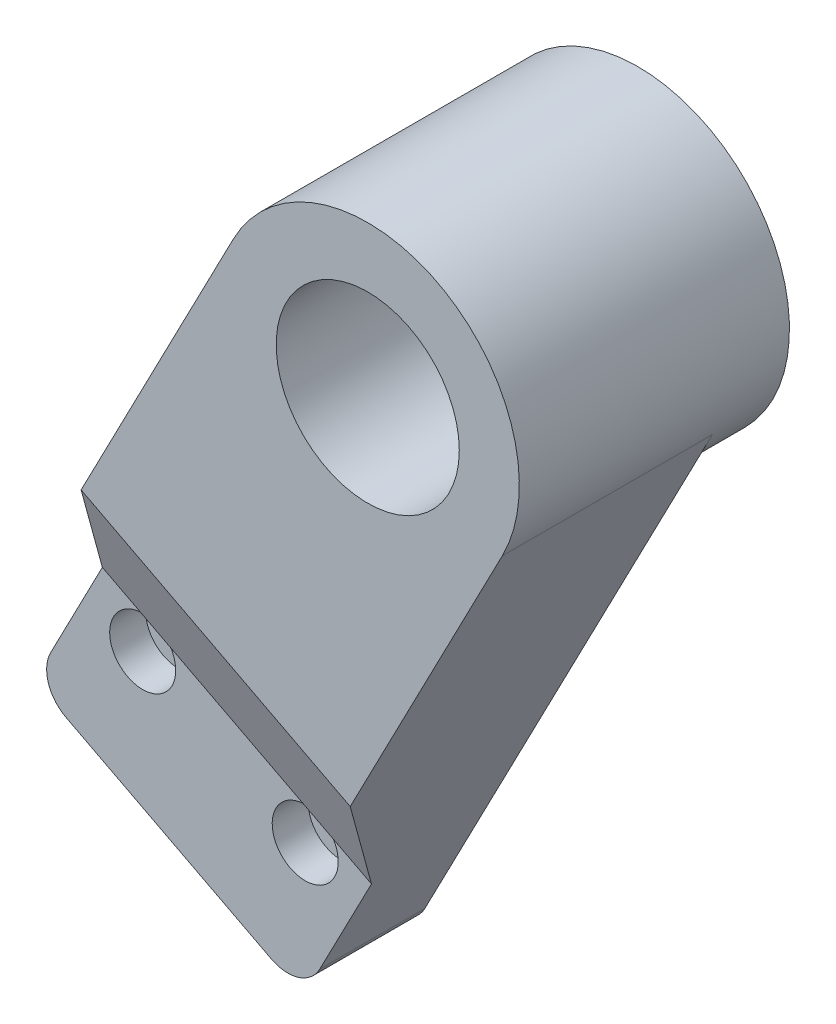
ISO-10303-21;
HEADER;
FILE_DESCRIPTION(('STEP AP214'),'2;1');
FILE_NAME('part.step','',(''),(''),'','','');
FILE_SCHEMA(('AUTOMOTIVE_DESIGN { 1 0 10303 214 1 1 1 1 }'));
ENDSEC;
DATA;
#1=APPLICATION_CONTEXT('core data for automotive mechanical design processes');
#2=APPLICATION_PROTOCOL_DEFINITION('international standard','automotive_design',2000,#1);
#3=PRODUCT_CONTEXT('',#1,'mechanical');
#4=PRODUCT('Part','Part','',(#3));
#5=PRODUCT_RELATED_PRODUCT_CATEGORY('part','',(#4));
#6=PRODUCT_DEFINITION_FORMATION('','',#4);
#7=PRODUCT_DEFINITION_CONTEXT('part definition',#1,'design');
#8=PRODUCT_DEFINITION('design','',#6,#7);
#9=PRODUCT_DEFINITION_SHAPE('','',#8);
#10=(LENGTH_UNIT() NAMED_UNIT(*) SI_UNIT(.MILLI.,.METRE.));
#11=(NAMED_UNIT(*) PLANE_ANGLE_UNIT() SI_UNIT($,.RADIAN.));
#12=(NAMED_UNIT(*) SI_UNIT($,.STERADIAN.) SOLID_ANGLE_UNIT());
#13=UNCERTAINTY_MEASURE_WITH_UNIT(LENGTH_MEASURE(1.E-05),#10,'distance_accuracy_value','');
#14=(GEOMETRIC_REPRESENTATION_CONTEXT(3) GLOBAL_UNCERTAINTY_ASSIGNED_CONTEXT((#13)) GLOBAL_UNIT_ASSIGNED_CONTEXT((#10,
#11,#12)) REPRESENTATION_CONTEXT('',''));
#15=CARTESIAN_POINT('',(0.,0.,0.));
#16=DIRECTION('',(0.,0.,1.));
#17=DIRECTION('',(1.,0.,0.));
#18=AXIS2_PLACEMENT_3D('',#15,#16,#17);
#19=CARTESIAN_POINT('',(-27.4940939778172,-36.4309678891319,-22.5));
#20=DIRECTION('',(0.,0.,1.));
#21=DIRECTION('',(1.,0.,0.));
#22=AXIS2_PLACEMENT_3D('',#19,#20,#21);
#23=CYLINDRICAL_SURFACE('',#22,1.6);
#24=CARTESIAN_POINT('',(-27.4940939778172,-36.4309678891319,-17.499996113941));
#25=DIRECTION('',(-9.77306432286574E-08,1.46589662699927E-09,0.999999999999995));
#26=DIRECTION('',(0.999999999999995,0.,9.77306432286574E-08));
#27=AXIS2_PLACEMENT_3D('',#24,#25,#26);
#28=CIRCLE('',#27,1.6);
#29=CARTESIAN_POINT('',(-25.8940939778172,-36.4309678891319,-17.499995957572));
#30=VERTEX_POINT('',#29);
#31=EDGE_CURVE('E210',#30,#30,#28,.T.);
#32=ORIENTED_EDGE('',*,*,#31,.F.);
#33=EDGE_LOOP('',(#32));
#34=FACE_BOUND('',#33,.T.);
#35=CARTESIAN_POINT('',(-27.4940939778172,-36.4309678891319,-11.7499978930527));
#36=DIRECTION('',(0.,0.,1.));
#37=DIRECTION('',(1.,0.,0.));
#38=AXIS2_PLACEMENT_3D('',#35,#36,#37);
#39=CIRCLE('',#38,1.6);
#40=CARTESIAN_POINT('',(-25.8940939778172,-36.4309678891319,-11.7499978930527));
#41=VERTEX_POINT('',#40);
#42=EDGE_CURVE('E49',#41,#41,#39,.F.);
#43=ORIENTED_EDGE('',*,*,#42,.F.);
#44=EDGE_LOOP('',(#43));
#45=FACE_BOUND('',#44,.T.);
#46=ADVANCED_FACE('F45',(#34,#45),#23,.F.);
#47=CARTESIAN_POINT('',(-13.957898201656,-43.4547776750981,-22.5));
#48=DIRECTION('',(0.,0.,1.));
#49=DIRECTION('',(1.,0.,0.));
#50=AXIS2_PLACEMENT_3D('',#47,#48,#49);
#51=CYLINDRICAL_SURFACE('',#50,1.6);
#52=CARTESIAN_POINT('',(-13.957898201656,-43.4547776750981,-17.4999947807437));
#53=DIRECTION('',(-9.77306432286574E-08,1.46589662699927E-09,0.999999999999995));
#54=DIRECTION('',(0.999999999999995,0.,9.77306432286574E-08));
#55=AXIS2_PLACEMENT_3D('',#52,#53,#54);
#56=CIRCLE('',#55,1.6);
#57=CARTESIAN_POINT('',(-12.357898201656,-43.4547776750981,-17.4999946243747));
#58=VERTEX_POINT('',#57);
#59=EDGE_CURVE('E215',#58,#58,#56,.T.);
#60=ORIENTED_EDGE('',*,*,#59,.F.);
#61=EDGE_LOOP('',(#60));
#62=FACE_BOUND('',#61,.T.);
#63=CARTESIAN_POINT('',(-13.957898201656,-43.4547776750981,-11.7499978930527));
#64=DIRECTION('',(0.,0.,1.));
#65=DIRECTION('',(1.,0.,0.));
#66=AXIS2_PLACEMENT_3D('',#63,#64,#65);
#67=CIRCLE('',#66,1.6);
#68=CARTESIAN_POINT('',(-12.357898201656,-43.4547776750981,-11.7499978930527));
#69=VERTEX_POINT('',#68);
#70=EDGE_CURVE('E128',#69,#69,#67,.F.);
#71=ORIENTED_EDGE('',*,*,#70,.F.);
#72=EDGE_LOOP('',(#71));
#73=FACE_BOUND('',#72,.T.);
#74=ADVANCED_FACE('F260',(#62,#73),#51,.F.);
#75=CARTESIAN_POINT('',(0.,0.,-58.2088924499207));
#76=DIRECTION('',(0.,0.,1.));
#77=DIRECTION('',(1.,0.,0.));
#78=AXIS2_PLACEMENT_3D('',#75,#76,#77);
#79=CYLINDRICAL_SURFACE('',#78,12.625);
#80=CARTESIAN_POINT('',(0.,0.,-22.5));
#81=DIRECTION('',(0.,0.,-1.));
#82=DIRECTION('',(-1.,0.,0.));
#83=AXIS2_PLACEMENT_3D('',#80,#81,#82);
#84=CIRCLE('',#83,12.625);
#85=CARTESIAN_POINT('',(-12.625,0.,-22.5));
#86=VERTEX_POINT('',#85);
#87=EDGE_CURVE('E180',#86,#86,#84,.F.);
#88=ORIENTED_EDGE('',*,*,#87,.T.);
#89=EDGE_LOOP('',(#88));
#90=FACE_BOUND('',#89,.T.);
#91=CARTESIAN_POINT('',(0.,0.,0.));
#92=DIRECTION('',(0.,0.,1.));
#93=DIRECTION('',(1.,0.,0.));
#94=AXIS2_PLACEMENT_3D('',#91,#92,#93);
#95=CIRCLE('',#94,12.625);
#96=CARTESIAN_POINT('',(11.2061948638712,-5.81479334739834,0.));
#97=VERTEX_POINT('',#96);
#98=CARTESIAN_POINT('',(-11.2061948638711,5.81479334739833,0.));
#99=VERTEX_POINT('',#98);
#100=EDGE_CURVE('E181',#97,#99,#95,.T.);
#101=ORIENTED_EDGE('',*,*,#100,.F.);
#102=DIRECTION('',(0.,0.,1.));
#103=VECTOR('',#102,1.);
#104=CARTESIAN_POINT('',(11.2061948638711,-5.81479334739833,-94.5295005600393));
#105=LINE('',#104,#103);
#106=CARTESIAN_POINT('',(11.2061948638711,-5.81479334739833,-17.499992376617));
#107=VERTEX_POINT('',#106);
#108=EDGE_CURVE('E164',#107,#97,#105,.T.);
#109=ORIENTED_EDGE('',*,*,#108,.F.);
#110=CARTESIAN_POINT('',(0.,0.,-17.4999934803296));
#111=DIRECTION('',(-9.77306432286574E-08,1.46589662699927E-09,0.999999999999995));
#112=DIRECTION('',(0.999999999999995,0.,9.77306432286574E-08));
#113=AXIS2_PLACEMENT_3D('',#110,#111,#112);
#114=CIRCLE('',#113,12.625);
#115=CARTESIAN_POINT('',(-11.2061948638712,5.81479334739833,-17.4999945840421));
#116=VERTEX_POINT('',#115);
#117=EDGE_CURVE('E167',#116,#107,#114,.T.);
#118=ORIENTED_EDGE('',*,*,#117,.F.);
#119=DIRECTION('',(0.,0.,1.));
#120=VECTOR('',#119,1.);
#121=CARTESIAN_POINT('',(-11.2061948638711,5.81479334739833,-94.5295005600393));
#122=LINE('',#121,#120);
#123=EDGE_CURVE('E174',#116,#99,#122,.T.);
#124=ORIENTED_EDGE('',*,*,#123,.T.);
#125=EDGE_LOOP('',(#101,#109,#118,#124));
#126=FACE_BOUND('',#125,.T.);
#127=ADVANCED_FACE('F256',(#90,#126),#79,.T.);
#128=CARTESIAN_POINT('',(0.,0.,-58.2088924499207));
#129=DIRECTION('',(0.,0.,1.));
#130=DIRECTION('',(1.,0.,0.));
#131=AXIS2_PLACEMENT_3D('',#128,#129,#130);
#132=CYLINDRICAL_SURFACE('',#131,7.625);
#133=CARTESIAN_POINT('',(0.,0.,0.));
#134=DIRECTION('',(0.,0.,1.));
#135=DIRECTION('',(1.,0.,0.));
#136=AXIS2_PLACEMENT_3D('',#133,#134,#135);
#137=CIRCLE('',#136,7.625);
#138=CARTESIAN_POINT('',(7.625,0.,0.));
#139=VERTEX_POINT('',#138);
#140=EDGE_CURVE('E185',#139,#139,#137,.T.);
#141=ORIENTED_EDGE('',*,*,#140,.T.);
#142=EDGE_LOOP('',(#141));
#143=FACE_BOUND('',#142,.T.);
#144=CARTESIAN_POINT('',(0.,0.,-22.5));
#145=DIRECTION('',(0.,0.,-1.));
#146=DIRECTION('',(-1.,0.,0.));
#147=AXIS2_PLACEMENT_3D('',#144,#145,#146);
#148=CIRCLE('',#147,7.625);
#149=CARTESIAN_POINT('',(-7.625,0.,-22.5));
#150=VERTEX_POINT('',#149);
#151=EDGE_CURVE('E184',#150,#150,#148,.F.);
#152=ORIENTED_EDGE('',*,*,#151,.F.);
#153=EDGE_LOOP('',(#152));
#154=FACE_BOUND('',#153,.T.);
#155=ADVANCED_FACE('F259',(#143,#154),#132,.F.);
#156=CARTESIAN_POINT('',(0.,0.,0.));
#157=DIRECTION('',(0.,0.,1.));
#158=DIRECTION('',(1.,0.,0.));
#159=AXIS2_PLACEMENT_3D('',#156,#157,#158);
#160=PLANE('',#159);
#161=DIRECTION('',(-0.887619395158111,0.460577690883036,0.));
#162=VECTOR('',#161,1.);
#163=CARTESIAN_POINT('',(19.6162379587022,-41.1604363110197,0.));
#164=LINE('',#163,#162);
#165=CARTESIAN_POINT('',(-1.45969163541235,-30.2243267142464,0.));
#166=VERTEX_POINT('',#165);
#167=CARTESIAN_POINT('',(-23.8720813631546,-18.5947400194497,0.));
#168=VERTEX_POINT('',#167);
#169=EDGE_CURVE('E149',#166,#168,#164,.T.);
#170=ORIENTED_EDGE('',*,*,#169,.F.);
#171=DIRECTION('',(0.460577690883036,0.887619395158111,0.));
#172=VECTOR('',#171,1.);
#173=CARTESIAN_POINT('',(11.2061948638711,-5.81479334739833,0.));
#174=LINE('',#173,#172);
#175=EDGE_CURVE('E172',#166,#97,#174,.T.);
#176=ORIENTED_EDGE('',*,*,#175,.T.);
#177=ORIENTED_EDGE('',*,*,#100,.T.);
#178=DIRECTION('',(-0.460577690883036,-0.887619395158111,0.));
#179=VECTOR('',#178,1.);
#180=CARTESIAN_POINT('',(-36.5379678624381,-43.0042733862978,0.));
#181=LINE('',#180,#179);
#182=EDGE_CURVE('E159',#99,#168,#181,.T.);
#183=ORIENTED_EDGE('',*,*,#182,.T.);
#184=EDGE_LOOP('',(#170,#176,#177,#183));
#185=FACE_BOUND('',#184,.T.);
#186=ORIENTED_EDGE('',*,*,#140,.F.);
#187=EDGE_LOOP('',(#186));
#188=FACE_BOUND('',#187,.T.);
#189=ADVANCED_FACE('F251',(#185,#188),#160,.T.);
#190=CARTESIAN_POINT('',(0.,0.,-22.5));
#191=DIRECTION('',(0.,0.,-1.));
#192=DIRECTION('',(-1.,0.,0.));
#193=AXIS2_PLACEMENT_3D('',#190,#191,#192);
#194=PLANE('',#193);
#195=ORIENTED_EDGE('',*,*,#87,.F.);
#196=EDGE_LOOP('',(#195));
#197=FACE_BOUND('',#196,.T.);
#198=ORIENTED_EDGE('',*,*,#151,.T.);
#199=EDGE_LOOP('',(#198));
#200=FACE_BOUND('',#199,.T.);
#201=ADVANCED_FACE('F292',(#197,#200),#194,.T.);
#202=CARTESIAN_POINT('',(11.2061948638711,-5.81479334739833,-94.5295005600393));
#203=DIRECTION('',(0.887619395158111,-0.460577690883036,0.));
#204=DIRECTION('',(0.460577690883036,0.887619395158111,0.));
#205=AXIS2_PLACEMENT_3D('',#202,#203,#204);
#206=PLANE('',#205);
#207=DIRECTION('',(0.460577690883036,0.887619395158111,0.));
#208=VECTOR('',#207,1.);
#209=CARTESIAN_POINT('',(11.2061948638711,-5.81479334739833,-8.74999789305274));
#210=LINE('',#209,#208);
#211=CARTESIAN_POINT('',(-12.7438450620467,-51.9710018956201,-8.74999789305274));
#212=VERTEX_POINT('',#211);
#213=CARTESIAN_POINT('',(-8.43994961722689,-43.676590014249,-8.74999789305273));
#214=VERTEX_POINT('',#213);
#215=EDGE_CURVE('E157',#212,#214,#210,.T.);
#216=ORIENTED_EDGE('',*,*,#215,.F.);
#217=DIRECTION('',(0.,0.,1.));
#218=VECTOR('',#217,1.);
#219=CARTESIAN_POINT('',(-12.7438450620467,-51.9710018956201,-94.5295005600393));
#220=LINE('',#219,#218);
#221=CARTESIAN_POINT('',(-12.7438450620467,-51.9710018956201,-17.4999946496096));
#222=VERTEX_POINT('',#221);
#223=EDGE_CURVE('E201',#212,#222,#220,.F.);
#224=ORIENTED_EDGE('',*,*,#223,.T.);
#225=DIRECTION('',(-0.460577690883036,-0.88761939515811,-4.37113957093476E-08));
#226=VECTOR('',#225,1.);
#227=CARTESIAN_POINT('',(11.2061933130751,-5.81479633607259,-17.4999923766172));
#228=LINE('',#227,#226);
#229=EDGE_CURVE('E163',#107,#222,#228,.T.);
#230=ORIENTED_EDGE('',*,*,#229,.F.);
#231=ORIENTED_EDGE('',*,*,#108,.T.);
#232=ORIENTED_EDGE('',*,*,#175,.F.);
#233=DIRECTION('',(0.398871980721086,0.768700945098702,0.500000000000001));
#234=VECTOR('',#233,1.);
#235=CARTESIAN_POINT('',(-10.8128613234287,-48.2496348992156,-11.7245258379738));
#236=LINE('',#235,#234);
#237=EDGE_CURVE('E155',#214,#166,#236,.T.);
#238=ORIENTED_EDGE('',*,*,#237,.F.);
#239=EDGE_LOOP('',(#216,#224,#230,#231,#232,#238));
#240=FACE_BOUND('',#239,.T.);
#241=ADVANCED_FACE('F247',(#240),#206,.T.);
#242=CARTESIAN_POINT('',(-14.1255781346958,-54.6338600810944,-94.5295005600393));
#243=DIRECTION('',(-0.460577690883036,-0.887619395158111,0.));
#244=DIRECTION('',(0.887619395158111,-0.460577690883036,0.));
#245=AXIS2_PLACEMENT_3D('',#242,#243,#244);
#246=PLANE('',#245);
#247=DIRECTION('',(-0.887619395158108,0.460577690883034,-8.74227737145706E-08));
#248=VECTOR('',#247,1.);
#249=CARTESIAN_POINT('',(-14.125584112043,-54.633856979503,-17.4999947807444));
#250=LINE('',#249,#248);
#251=CARTESIAN_POINT('',(-16.7884363201702,-53.2521270084453,-17.4999950430121));
#252=VERTEX_POINT('',#251);
#253=CARTESIAN_POINT('',(-33.8751096769638,-44.3860064589469,-17.4999967259005));
#254=VERTEX_POINT('',#253);
#255=EDGE_CURVE('E160',#252,#254,#250,.T.);
#256=ORIENTED_EDGE('',*,*,#255,.F.);
#257=DIRECTION('',(0.,0.,1.));
#258=VECTOR('',#257,1.);
#259=CARTESIAN_POINT('',(-16.7884363201702,-53.2521270084453,-94.5295005600393));
#260=LINE('',#259,#258);
#261=CARTESIAN_POINT('',(-16.7884363201702,-53.2521270084453,-8.74999789305274));
#262=VERTEX_POINT('',#261);
#263=EDGE_CURVE('E194',#252,#262,#260,.T.);
#264=ORIENTED_EDGE('',*,*,#263,.T.);
#265=DIRECTION('',(-0.887619395158111,0.460577690883036,0.));
#266=VECTOR('',#265,1.);
#267=CARTESIAN_POINT('',(6.95035145941866,-65.5699696778677,-8.74999789305274));
#268=LINE('',#267,#266);
#269=CARTESIAN_POINT('',(-33.8751096769638,-44.3860064589469,-8.74999789305274));
#270=VERTEX_POINT('',#269);
#271=EDGE_CURVE('E148',#262,#270,#268,.T.);
#272=ORIENTED_EDGE('',*,*,#271,.T.);
#273=DIRECTION('',(0.,0.,1.));
#274=VECTOR('',#273,1.);
#275=CARTESIAN_POINT('',(-33.8751096769638,-44.3860064589469,-94.5295005600393));
#276=LINE('',#275,#274);
#277=EDGE_CURVE('E192',#270,#254,#276,.F.);
#278=ORIENTED_EDGE('',*,*,#277,.T.);
#279=EDGE_LOOP('',(#256,#264,#272,#278));
#280=FACE_BOUND('',#279,.T.);
#281=ADVANCED_FACE('F235',(#280),#246,.T.);
#282=CARTESIAN_POINT('',(-36.5379678624381,-43.0042733862978,-94.5295005600393));
#283=DIRECTION('',(-0.887619395158111,0.460577690883036,0.));
#284=DIRECTION('',(-0.460577690883036,-0.887619395158111,0.));
#285=AXIS2_PLACEMENT_3D('',#282,#283,#284);
#286=PLANE('',#285);
#287=DIRECTION('',(0.460577690883036,0.88761939515811,4.37113957093476E-08));
#288=VECTOR('',#287,1.);
#289=CARTESIAN_POINT('',(-36.5379694132341,-43.0042763749718,-17.499996988169));
#290=LINE('',#289,#288);
#291=CARTESIAN_POINT('',(-35.156234789789,-40.3414152008234,-17.4999968570347));
#292=VERTEX_POINT('',#291);
#293=EDGE_CURVE('E169',#292,#116,#290,.T.);
#294=ORIENTED_EDGE('',*,*,#293,.F.);
#295=DIRECTION('',(0.,0.,1.));
#296=VECTOR('',#295,1.);
#297=CARTESIAN_POINT('',(-35.156234789789,-40.3414152008234,-94.5295005600393));
#298=LINE('',#297,#296);
#299=CARTESIAN_POINT('',(-35.156234789789,-40.3414152008234,-8.74999789305274));
#300=VERTEX_POINT('',#299);
#301=EDGE_CURVE('E11',#292,#300,#298,.T.);
#302=ORIENTED_EDGE('',*,*,#301,.T.);
#303=DIRECTION('',(-0.460577690883036,-0.887619395158111,0.));
#304=VECTOR('',#303,1.);
#305=CARTESIAN_POINT('',(-36.5379678624382,-43.0042733862978,-8.74999789305274));
#306=LINE('',#305,#304);
#307=CARTESIAN_POINT('',(-30.8523393449692,-32.0470033194523,-8.74999789305274));
#308=VERTEX_POINT('',#307);
#309=EDGE_CURVE('E154',#308,#300,#306,.T.);
#310=ORIENTED_EDGE('',*,*,#309,.F.);
#311=DIRECTION('',(-0.398871980721086,-0.768700945098702,-0.500000000000001));
#312=VECTOR('',#311,1.);
#313=CARTESIAN_POINT('',(-30.8523393449692,-32.0470033194523,-8.74999789305274));
#314=LINE('',#313,#312);
#315=EDGE_CURVE('E218',#168,#308,#314,.T.);
#316=ORIENTED_EDGE('',*,*,#315,.F.);
#317=ORIENTED_EDGE('',*,*,#182,.F.);
#318=ORIENTED_EDGE('',*,*,#123,.F.);
#319=EDGE_LOOP('',(#294,#302,#310,#316,#317,#318));
#320=FACE_BOUND('',#319,.T.);
#321=ADVANCED_FACE('F227',(#320),#286,.T.);
#322=CARTESIAN_POINT('',(7.9344159646305,-205.729840450457,-17.4999924033153));
#323=DIRECTION('',(-9.77306432286574E-08,1.46589662699927E-09,0.999999999999995));
#324=DIRECTION('',(0.887619395158108,-0.460577690883035,8.74227737145706E-08));
#325=AXIS2_PLACEMENT_3D('',#322,#323,#324);
#326=PLANE('',#325);
#327=ORIENTED_EDGE('',*,*,#59,.T.);
#328=EDGE_LOOP('',(#327));
#329=FACE_BOUND('',#328,.T.);
#330=ORIENTED_EDGE('',*,*,#31,.T.);
#331=EDGE_LOOP('',(#330));
#332=FACE_BOUND('',#331,.T.);
#333=ORIENTED_EDGE('',*,*,#229,.T.);
#334=CARTESIAN_POINT('',(-15.4067032475211,-50.589268822971,-17.499994911878));
#335=DIRECTION('',(-9.77306432286574E-08,1.46589662699927E-09,0.999999999999995));
#336=DIRECTION('',(0.999999999999995,0.,9.77306432286574E-08));
#337=AXIS2_PLACEMENT_3D('',#334,#335,#336);
#338=CIRCLE('',#337,3.);
#339=EDGE_CURVE('E54',#222,#252,#338,.F.);
#340=ORIENTED_EDGE('',*,*,#339,.T.);
#341=ORIENTED_EDGE('',*,*,#255,.T.);
#342=CARTESIAN_POINT('',(-32.4933766043147,-41.7231482734725,-17.4999965947664));
#343=DIRECTION('',(-9.77306432286574E-08,1.46589662699927E-09,0.999999999999995));
#344=DIRECTION('',(0.999999999999995,0.,9.77306432286574E-08));
#345=AXIS2_PLACEMENT_3D('',#342,#343,#344);
#346=CIRCLE('',#345,3.);
#347=EDGE_CURVE('E203',#254,#292,#346,.F.);
#348=ORIENTED_EDGE('',*,*,#347,.T.);
#349=ORIENTED_EDGE('',*,*,#293,.T.);
#350=ORIENTED_EDGE('',*,*,#117,.T.);
#351=EDGE_LOOP('',(#333,#340,#341,#348,#349,#350));
#352=FACE_BOUND('',#351,.T.);
#353=ADVANCED_FACE('F238',(#329,#332,#352),#326,.F.);
#354=CARTESIAN_POINT('',(6.95035145941866,-65.5699696778677,-8.74999789305274));
#355=DIRECTION('',(0.,0.,-1.));
#356=DIRECTION('',(-1.,0.,0.));
#357=AXIS2_PLACEMENT_3D('',#354,#355,#356);
#358=PLANE('',#357);
#359=DIRECTION('',(-0.887619395158111,0.460577690883036,0.));
#360=VECTOR('',#359,1.);
#361=CARTESIAN_POINT('',(12.6359799768876,-54.6126996110222,-8.74999789305274));
#362=LINE('',#361,#360);
#363=CARTESIAN_POINT('',(-11.6023603485401,-42.0356436354325,-8.74999789305274));
#364=VERTEX_POINT('',#363);
#365=EDGE_CURVE('E141',#214,#364,#362,.T.);
#366=ORIENTED_EDGE('',*,*,#365,.T.);
#367=CARTESIAN_POINT('',(-13.957898201656,-43.4547776750981,-8.74999789305274));
#368=DIRECTION('',(0.,0.,1.));
#369=DIRECTION('',(1.,0.,0.));
#370=AXIS2_PLACEMENT_3D('',#367,#368,#369);
#371=CIRCLE('',#370,2.75);
#372=CARTESIAN_POINT('',(-14.1537328374948,-40.711759484235,-8.74999789305274));
#373=VERTEX_POINT('',#372);
#374=EDGE_CURVE('E134',#373,#364,#371,.T.);
#375=ORIENTED_EDGE('',*,*,#374,.F.);
#376=CARTESIAN_POINT('',(-25.1385561247012,-35.0118338494662,-8.74999789305274));
#377=VERTEX_POINT('',#376);
#378=EDGE_CURVE('E140',#373,#377,#362,.T.);
#379=ORIENTED_EDGE('',*,*,#378,.T.);
#380=CARTESIAN_POINT('',(-27.4940939778172,-36.4309678891319,-8.74999789305274));
#381=DIRECTION('',(0.,0.,1.));
#382=DIRECTION('',(1.,0.,0.));
#383=AXIS2_PLACEMENT_3D('',#380,#381,#382);
#384=CIRCLE('',#383,2.75);
#385=CARTESIAN_POINT('',(-27.689928613656,-33.6879496982688,-8.74999789305274));
#386=VERTEX_POINT('',#385);
#387=EDGE_CURVE('E339',#386,#377,#384,.T.);
#388=ORIENTED_EDGE('',*,*,#387,.F.);
#389=EDGE_CURVE('E146',#386,#308,#362,.T.);
#390=ORIENTED_EDGE('',*,*,#389,.T.);
#391=ORIENTED_EDGE('',*,*,#309,.T.);
#392=CARTESIAN_POINT('',(-32.4933766043147,-41.7231482734725,-8.74999789305274));
#393=DIRECTION('',(0.,0.,-1.));
#394=DIRECTION('',(-1.,0.,0.));
#395=AXIS2_PLACEMENT_3D('',#392,#393,#394);
#396=CIRCLE('',#395,3.);
#397=EDGE_CURVE('E197',#300,#270,#396,.F.);
#398=ORIENTED_EDGE('',*,*,#397,.T.);
#399=ORIENTED_EDGE('',*,*,#271,.F.);
#400=CARTESIAN_POINT('',(-15.4067032475211,-50.589268822971,-8.74999789305274));
#401=DIRECTION('',(0.,0.,-1.));
#402=DIRECTION('',(-1.,0.,0.));
#403=AXIS2_PLACEMENT_3D('',#400,#401,#402);
#404=CIRCLE('',#403,3.);
#405=EDGE_CURVE('E199',#262,#212,#404,.F.);
#406=ORIENTED_EDGE('',*,*,#405,.T.);
#407=ORIENTED_EDGE('',*,*,#215,.T.);
#408=EDGE_LOOP('',(#366,#375,#379,#388,#390,#391,#398,#399,#406,#407));
#409=FACE_BOUND('',#408,.T.);
#410=ADVANCED_FACE('F138',(#409),#358,.F.);
#411=CARTESIAN_POINT('',(12.6359799768876,-54.6126996110222,-8.74999789305274));
#412=DIRECTION('',(0.230288845441518,0.443809697579056,-0.866025403784438));
#413=DIRECTION('',(0.,0.889945063336666,0.456067740848547));
#414=AXIS2_PLACEMENT_3D('',#411,#412,#413);
#415=PLANE('',#414);
#416=ORIENTED_EDGE('',*,*,#237,.T.);
#417=ORIENTED_EDGE('',*,*,#169,.T.);
#418=ORIENTED_EDGE('',*,*,#315,.T.);
#419=ORIENTED_EDGE('',*,*,#389,.F.);
#420=DIRECTION('',(0.887619395158111,-0.460577690883036,0.));
#421=VECTOR('',#420,1.);
#422=CARTESIAN_POINT('',(12.6359799768876,-54.6126996110222,-8.74999789305274));
#423=LINE('',#422,#421);
#424=EDGE_CURVE('E145',#386,#377,#423,.T.);
#425=ORIENTED_EDGE('',*,*,#424,.T.);
#426=ORIENTED_EDGE('',*,*,#378,.F.);
#427=DIRECTION('',(0.887619395158111,-0.460577690883036,0.));
#428=VECTOR('',#427,1.);
#429=CARTESIAN_POINT('',(12.6359799768876,-54.6126996110222,-8.74999789305274));
#430=LINE('',#429,#428);
#431=EDGE_CURVE('E122',#373,#364,#430,.T.);
#432=ORIENTED_EDGE('',*,*,#431,.T.);
#433=ORIENTED_EDGE('',*,*,#365,.F.);
#434=EDGE_LOOP('',(#416,#417,#418,#419,#425,#426,#432,#433));
#435=FACE_BOUND('',#434,.T.);
#436=ADVANCED_FACE('F143',(#435),#415,.F.);
#437=CARTESIAN_POINT('',(-15.4067032475211,-50.589268822971,-94.5295005600393));
#438=DIRECTION('',(0.,0.,1.));
#439=DIRECTION('',(1.,0.,0.));
#440=AXIS2_PLACEMENT_3D('',#437,#438,#439);
#441=CYLINDRICAL_SURFACE('',#440,3.);
#442=ORIENTED_EDGE('',*,*,#339,.F.);
#443=ORIENTED_EDGE('',*,*,#223,.F.);
#444=ORIENTED_EDGE('',*,*,#405,.F.);
#445=ORIENTED_EDGE('',*,*,#263,.F.);
#446=EDGE_LOOP('',(#442,#443,#444,#445));
#447=FACE_BOUND('',#446,.T.);
#448=ADVANCED_FACE('F243',(#447),#441,.T.);
#449=CARTESIAN_POINT('',(-32.4933766043147,-41.7231482734725,-94.5295005600393));
#450=DIRECTION('',(0.,0.,1.));
#451=DIRECTION('',(1.,0.,0.));
#452=AXIS2_PLACEMENT_3D('',#449,#450,#451);
#453=CYLINDRICAL_SURFACE('',#452,3.);
#454=ORIENTED_EDGE('',*,*,#347,.F.);
#455=ORIENTED_EDGE('',*,*,#277,.F.);
#456=ORIENTED_EDGE('',*,*,#397,.F.);
#457=ORIENTED_EDGE('',*,*,#301,.F.);
#458=EDGE_LOOP('',(#454,#455,#456,#457));
#459=FACE_BOUND('',#458,.T.);
#460=ADVANCED_FACE('F47',(#459),#453,.T.);
#461=CARTESIAN_POINT('',(-13.957898201656,-43.4547776750981,-11.7499978930527));
#462=DIRECTION('',(0.,0.,1.));
#463=DIRECTION('',(1.,0.,0.));
#464=AXIS2_PLACEMENT_3D('',#461,#462,#463);
#465=PLANE('',#464);
#466=CARTESIAN_POINT('',(-13.957898201656,-43.4547776750981,-11.7499978930527));
#467=DIRECTION('',(0.,0.,1.));
#468=DIRECTION('',(1.,0.,0.));
#469=AXIS2_PLACEMENT_3D('',#466,#467,#468);
#470=CIRCLE('',#469,2.75);
#471=CARTESIAN_POINT('',(-11.207898201656,-43.4547776750981,-11.7499978930527));
#472=VERTEX_POINT('',#471);
#473=EDGE_CURVE('E129',#472,#472,#470,.T.);
#474=ORIENTED_EDGE('',*,*,#473,.T.);
#475=EDGE_LOOP('',(#474));
#476=FACE_BOUND('',#475,.T.);
#477=ORIENTED_EDGE('',*,*,#70,.T.);
#478=EDGE_LOOP('',(#477));
#479=FACE_BOUND('',#478,.T.);
#480=ADVANCED_FACE('F308',(#476,#479),#465,.T.);
#481=CARTESIAN_POINT('',(-13.957898201656,-43.4547776750981,-8.74999789305274));
#482=DIRECTION('',(0.,0.,1.));
#483=DIRECTION('',(1.,0.,0.));
#484=AXIS2_PLACEMENT_3D('',#481,#482,#483);
#485=PLANE('',#484);
#486=EDGE_CURVE('E68',#364,#373,#371,.T.);
#487=ORIENTED_EDGE('',*,*,#486,.F.);
#488=ORIENTED_EDGE('',*,*,#431,.F.);
#489=EDGE_LOOP('',(#487,#488));
#490=FACE_BOUND('',#489,.T.);
#491=ADVANCED_FACE('F123',(#490),#485,.F.);
#492=CARTESIAN_POINT('',(-13.957898201656,-43.4547776750981,-11.7499978930527));
#493=DIRECTION('',(0.,0.,1.));
#494=DIRECTION('',(1.,0.,0.));
#495=AXIS2_PLACEMENT_3D('',#492,#493,#494);
#496=CYLINDRICAL_SURFACE('',#495,2.75);
#497=ORIENTED_EDGE('',*,*,#473,.F.);
#498=EDGE_LOOP('',(#497));
#499=FACE_BOUND('',#498,.T.);
#500=ORIENTED_EDGE('',*,*,#486,.T.);
#501=ORIENTED_EDGE('',*,*,#374,.T.);
#502=EDGE_LOOP('',(#500,#501));
#503=FACE_BOUND('',#502,.T.);
#504=ADVANCED_FACE('F133',(#499,#503),#496,.F.);
#505=CARTESIAN_POINT('',(-27.4940939778172,-36.4309678891319,-11.7499978930527));
#506=DIRECTION('',(0.,0.,1.));
#507=DIRECTION('',(1.,0.,0.));
#508=AXIS2_PLACEMENT_3D('',#505,#506,#507);
#509=PLANE('',#508);
#510=CARTESIAN_POINT('',(-27.4940939778172,-36.4309678891319,-11.7499978930527));
#511=DIRECTION('',(0.,0.,1.));
#512=DIRECTION('',(1.,0.,0.));
#513=AXIS2_PLACEMENT_3D('',#510,#511,#512);
#514=CIRCLE('',#513,2.75);
#515=CARTESIAN_POINT('',(-24.7440939778172,-36.4309678891319,-11.7499978930527));
#516=VERTEX_POINT('',#515);
#517=EDGE_CURVE('E337',#516,#516,#514,.T.);
#518=ORIENTED_EDGE('',*,*,#517,.T.);
#519=EDGE_LOOP('',(#518));
#520=FACE_BOUND('',#519,.T.);
#521=ORIENTED_EDGE('',*,*,#42,.T.);
#522=EDGE_LOOP('',(#521));
#523=FACE_BOUND('',#522,.T.);
#524=ADVANCED_FACE('F322',(#520,#523),#509,.T.);
#525=CARTESIAN_POINT('',(-27.4940939778172,-36.4309678891319,-8.74999789305274));
#526=DIRECTION('',(0.,0.,1.));
#527=DIRECTION('',(1.,0.,0.));
#528=AXIS2_PLACEMENT_3D('',#525,#526,#527);
#529=PLANE('',#528);
#530=EDGE_CURVE('E61',#377,#386,#384,.T.);
#531=ORIENTED_EDGE('',*,*,#530,.F.);
#532=ORIENTED_EDGE('',*,*,#424,.F.);
#533=EDGE_LOOP('',(#531,#532));
#534=FACE_BOUND('',#533,.T.);
#535=ADVANCED_FACE('F327',(#534),#529,.F.);
#536=CARTESIAN_POINT('',(-27.4940939778172,-36.4309678891319,-11.7499978930527));
#537=DIRECTION('',(0.,0.,1.));
#538=DIRECTION('',(1.,0.,0.));
#539=AXIS2_PLACEMENT_3D('',#536,#537,#538);
#540=CYLINDRICAL_SURFACE('',#539,2.75);
#541=ORIENTED_EDGE('',*,*,#517,.F.);
#542=EDGE_LOOP('',(#541));
#543=FACE_BOUND('',#542,.T.);
#544=ORIENTED_EDGE('',*,*,#530,.T.);
#545=ORIENTED_EDGE('',*,*,#387,.T.);
#546=EDGE_LOOP('',(#544,#545));
#547=FACE_BOUND('',#546,.T.);
#548=ADVANCED_FACE('F324',(#543,#547),#540,.F.);
#549=CLOSED_SHELL('',(#46,#74,#127,#155,#189,#201,#241,#281,#321,#353,#410,#436,#448,#460,#480,
#491,#504,#524,#535,#548));
#550=MANIFOLD_SOLID_BREP('B2',#549);
#551=ADVANCED_BREP_SHAPE_REPRESENTATION('',(#18,#550),#14);
#552=SHAPE_DEFINITION_REPRESENTATION(#9,#551);
ENDSEC;
END-ISO-10303-21;
